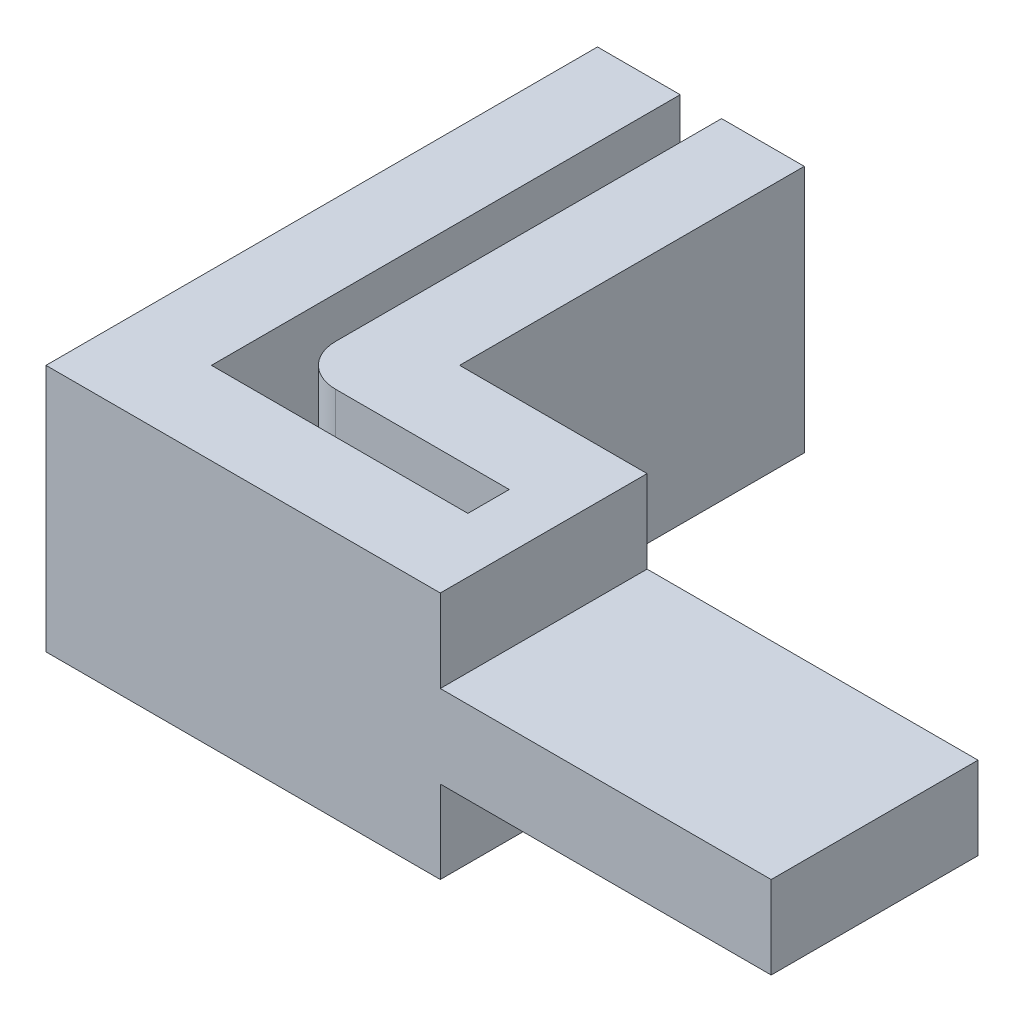
ISO-10303-21;
HEADER;
FILE_DESCRIPTION(('STEP AP214'),'2;1');
FILE_NAME('part.step','',(''),(''),'','','');
FILE_SCHEMA(('AUTOMOTIVE_DESIGN { 1 0 10303 214 1 1 1 1 }'));
ENDSEC;
DATA;
#1=APPLICATION_CONTEXT('core data for automotive mechanical design processes');
#2=APPLICATION_PROTOCOL_DEFINITION('international standard','automotive_design',2000,#1);
#3=PRODUCT_CONTEXT('',#1,'mechanical');
#4=PRODUCT('Part','Part','',(#3));
#5=PRODUCT_RELATED_PRODUCT_CATEGORY('part','',(#4));
#6=PRODUCT_DEFINITION_FORMATION('','',#4);
#7=PRODUCT_DEFINITION_CONTEXT('part definition',#1,'design');
#8=PRODUCT_DEFINITION('design','',#6,#7);
#9=PRODUCT_DEFINITION_SHAPE('','',#8);
#10=(LENGTH_UNIT() NAMED_UNIT(*) SI_UNIT(.MILLI.,.METRE.));
#11=(NAMED_UNIT(*) PLANE_ANGLE_UNIT() SI_UNIT($,.RADIAN.));
#12=(NAMED_UNIT(*) SI_UNIT($,.STERADIAN.) SOLID_ANGLE_UNIT());
#13=UNCERTAINTY_MEASURE_WITH_UNIT(LENGTH_MEASURE(1.E-05),#10,'distance_accuracy_value','');
#14=(GEOMETRIC_REPRESENTATION_CONTEXT(3) GLOBAL_UNCERTAINTY_ASSIGNED_CONTEXT((#13)) GLOBAL_UNIT_ASSIGNED_CONTEXT((#10,
#11,#12)) REPRESENTATION_CONTEXT('',''));
#15=CARTESIAN_POINT('',(0.,0.,0.));
#16=DIRECTION('',(0.,0.,1.));
#17=DIRECTION('',(1.,0.,0.));
#18=AXIS2_PLACEMENT_3D('',#15,#16,#17);
#19=CARTESIAN_POINT('',(5.65,9.,0.));
#20=DIRECTION('',(-1.,0.,0.));
#21=DIRECTION('',(0.,0.,1.));
#22=AXIS2_PLACEMENT_3D('',#19,#20,#21);
#23=PLANE('',#22);
#24=DIRECTION('',(0.,0.,-1.));
#25=VECTOR('',#24,1.);
#26=CARTESIAN_POINT('',(5.65,3.,1.5));
#27=LINE('',#26,#25);
#28=CARTESIAN_POINT('',(5.65,3.,1.5));
#29=VERTEX_POINT('',#28);
#30=CARTESIAN_POINT('',(5.65,3.,-6.));
#31=VERTEX_POINT('',#30);
#32=EDGE_CURVE('E50',#29,#31,#27,.T.);
#33=ORIENTED_EDGE('',*,*,#32,.F.);
#34=DIRECTION('',(0.,-1.,0.));
#35=VECTOR('',#34,1.);
#36=CARTESIAN_POINT('',(5.65,9.,1.5));
#37=LINE('',#36,#35);
#38=CARTESIAN_POINT('',(5.65,0.,1.5));
#39=VERTEX_POINT('',#38);
#40=EDGE_CURVE('E259',#29,#39,#37,.T.);
#41=ORIENTED_EDGE('',*,*,#40,.T.);
#42=DIRECTION('',(0.,0.,-1.));
#43=VECTOR('',#42,1.);
#44=CARTESIAN_POINT('',(5.65,0.,0.));
#45=LINE('',#44,#43);
#46=CARTESIAN_POINT('',(5.65,0.,-6.));
#47=VERTEX_POINT('',#46);
#48=EDGE_CURVE('E225',#39,#47,#45,.T.);
#49=ORIENTED_EDGE('',*,*,#48,.T.);
#50=DIRECTION('',(0.,-1.,0.));
#51=VECTOR('',#50,1.);
#52=CARTESIAN_POINT('',(5.65,9.,-6.));
#53=LINE('',#52,#51);
#54=EDGE_CURVE('E55',#31,#47,#53,.T.);
#55=ORIENTED_EDGE('',*,*,#54,.F.);
#56=EDGE_LOOP('',(#33,#41,#49,#55));
#57=FACE_BOUND('',#56,.T.);
#58=ADVANCED_FACE('F35',(#57),#23,.F.);
#59=DIRECTION('',(0.,0.,1.));
#60=VECTOR('',#59,1.);
#61=CARTESIAN_POINT('',(5.65,6.,1.5));
#62=LINE('',#61,#60);
#63=CARTESIAN_POINT('',(5.65,6.,-6.));
#64=VERTEX_POINT('',#63);
#65=CARTESIAN_POINT('',(5.65,6.,1.5));
#66=VERTEX_POINT('',#65);
#67=EDGE_CURVE('E339',#64,#66,#62,.T.);
#68=ORIENTED_EDGE('',*,*,#67,.F.);
#69=CARTESIAN_POINT('',(5.65,9.,-6.));
#70=VERTEX_POINT('',#69);
#71=EDGE_CURVE('E177',#70,#64,#53,.T.);
#72=ORIENTED_EDGE('',*,*,#71,.F.);
#73=DIRECTION('',(0.,0.,-1.));
#74=VECTOR('',#73,1.);
#75=CARTESIAN_POINT('',(5.65,9.,0.));
#76=LINE('',#75,#74);
#77=CARTESIAN_POINT('',(5.65,9.,1.5));
#78=VERTEX_POINT('',#77);
#79=EDGE_CURVE('E198',#78,#70,#76,.T.);
#80=ORIENTED_EDGE('',*,*,#79,.F.);
#81=EDGE_CURVE('E260',#78,#66,#37,.T.);
#82=ORIENTED_EDGE('',*,*,#81,.T.);
#83=EDGE_LOOP('',(#68,#72,#80,#82));
#84=FACE_BOUND('',#83,.T.);
#85=ADVANCED_FACE('F322',(#84),#23,.F.);
#86=CARTESIAN_POINT('',(-5.65,9.,0.));
#87=DIRECTION('',(1.,0.,0.));
#88=DIRECTION('',(0.,0.,-1.));
#89=AXIS2_PLACEMENT_3D('',#86,#87,#88);
#90=PLANE('',#89);
#91=DIRECTION('',(0.,0.,1.));
#92=VECTOR('',#91,1.);
#93=CARTESIAN_POINT('',(-5.65,0.,0.));
#94=LINE('',#93,#92);
#95=CARTESIAN_POINT('',(-5.65,0.,-18.5));
#96=VERTEX_POINT('',#95);
#97=CARTESIAN_POINT('',(-5.65,0.,-1.5));
#98=VERTEX_POINT('',#97);
#99=EDGE_CURVE('E178',#96,#98,#94,.T.);
#100=ORIENTED_EDGE('',*,*,#99,.F.);
#101=DIRECTION('',(0.,-1.,0.));
#102=VECTOR('',#101,1.);
#103=CARTESIAN_POINT('',(-5.65,9.,-18.5));
#104=LINE('',#103,#102);
#105=CARTESIAN_POINT('',(-5.65,9.,-18.5));
#106=VERTEX_POINT('',#105);
#107=EDGE_CURVE('E267',#106,#96,#104,.T.);
#108=ORIENTED_EDGE('',*,*,#107,.F.);
#109=DIRECTION('',(0.,0.,1.));
#110=VECTOR('',#109,1.);
#111=CARTESIAN_POINT('',(-5.65,9.,0.));
#112=LINE('',#111,#110);
#113=CARTESIAN_POINT('',(-5.65,9.,-1.5));
#114=VERTEX_POINT('',#113);
#115=EDGE_CURVE('E187',#106,#114,#112,.T.);
#116=ORIENTED_EDGE('',*,*,#115,.T.);
#117=DIRECTION('',(0.,-1.,0.));
#118=VECTOR('',#117,1.);
#119=CARTESIAN_POINT('',(-5.65,9.,-1.5));
#120=LINE('',#119,#118);
#121=EDGE_CURVE('E216',#114,#98,#120,.T.);
#122=ORIENTED_EDGE('',*,*,#121,.T.);
#123=EDGE_LOOP('',(#100,#108,#116,#122));
#124=FACE_BOUND('',#123,.T.);
#125=ADVANCED_FACE('F306',(#124),#90,.T.);
#126=CARTESIAN_POINT('',(0.,9.,-18.5));
#127=DIRECTION('',(0.,0.,-1.));
#128=DIRECTION('',(-1.,0.,0.));
#129=AXIS2_PLACEMENT_3D('',#126,#127,#128);
#130=PLANE('',#129);
#131=DIRECTION('',(1.,0.,0.));
#132=VECTOR('',#131,1.);
#133=CARTESIAN_POINT('',(0.,0.,-18.5));
#134=LINE('',#133,#132);
#135=CARTESIAN_POINT('',(-8.65,0.,-18.5));
#136=VERTEX_POINT('',#135);
#137=EDGE_CURVE('E181',#136,#96,#134,.T.);
#138=ORIENTED_EDGE('',*,*,#137,.F.);
#139=DIRECTION('',(0.,-1.,0.));
#140=VECTOR('',#139,1.);
#141=CARTESIAN_POINT('',(-8.65,9.,-18.5));
#142=LINE('',#141,#140);
#143=CARTESIAN_POINT('',(-8.65,9.,-18.5));
#144=VERTEX_POINT('',#143);
#145=EDGE_CURVE('E265',#144,#136,#142,.T.);
#146=ORIENTED_EDGE('',*,*,#145,.F.);
#147=DIRECTION('',(1.,0.,0.));
#148=VECTOR('',#147,1.);
#149=CARTESIAN_POINT('',(0.,9.,-18.5));
#150=LINE('',#149,#148);
#151=EDGE_CURVE('E190',#144,#106,#150,.T.);
#152=ORIENTED_EDGE('',*,*,#151,.T.);
#153=ORIENTED_EDGE('',*,*,#107,.T.);
#154=EDGE_LOOP('',(#138,#146,#152,#153));
#155=FACE_BOUND('',#154,.T.);
#156=ADVANCED_FACE('F309',(#155),#130,.T.);
#157=CARTESIAN_POINT('',(-8.65,9.,0.));
#158=DIRECTION('',(1.,0.,0.));
#159=DIRECTION('',(0.,0.,-1.));
#160=AXIS2_PLACEMENT_3D('',#157,#158,#159);
#161=PLANE('',#160);
#162=DIRECTION('',(0.,0.,1.));
#163=VECTOR('',#162,1.);
#164=CARTESIAN_POINT('',(-8.65,0.,0.));
#165=LINE('',#164,#163);
#166=CARTESIAN_POINT('',(-8.65,0.,1.5));
#167=VERTEX_POINT('',#166);
#168=EDGE_CURVE('E220',#136,#167,#165,.T.);
#169=ORIENTED_EDGE('',*,*,#168,.T.);
#170=DIRECTION('',(0.,-1.,0.));
#171=VECTOR('',#170,1.);
#172=CARTESIAN_POINT('',(-8.65,9.,1.5));
#173=LINE('',#172,#171);
#174=CARTESIAN_POINT('',(-8.65,9.,1.5));
#175=VERTEX_POINT('',#174);
#176=EDGE_CURVE('E262',#175,#167,#173,.T.);
#177=ORIENTED_EDGE('',*,*,#176,.F.);
#178=DIRECTION('',(0.,0.,1.));
#179=VECTOR('',#178,1.);
#180=CARTESIAN_POINT('',(-8.65,9.,0.));
#181=LINE('',#180,#179);
#182=EDGE_CURVE('E194',#144,#175,#181,.T.);
#183=ORIENTED_EDGE('',*,*,#182,.F.);
#184=ORIENTED_EDGE('',*,*,#145,.T.);
#185=EDGE_LOOP('',(#169,#177,#183,#184));
#186=FACE_BOUND('',#185,.T.);
#187=ADVANCED_FACE('F315',(#186),#161,.F.);
#188=CARTESIAN_POINT('',(0.,9.,1.5));
#189=DIRECTION('',(0.,0.,-1.));
#190=DIRECTION('',(-1.,0.,0.));
#191=AXIS2_PLACEMENT_3D('',#188,#189,#190);
#192=PLANE('',#191);
#193=DIRECTION('',(1.,0.,0.));
#194=VECTOR('',#193,1.);
#195=CARTESIAN_POINT('',(0.,0.,1.5));
#196=LINE('',#195,#194);
#197=EDGE_CURVE('E222',#167,#39,#196,.T.);
#198=ORIENTED_EDGE('',*,*,#197,.T.);
#199=ORIENTED_EDGE('',*,*,#40,.F.);
#200=DIRECTION('',(-1.,0.,0.));
#201=VECTOR('',#200,1.);
#202=CARTESIAN_POINT('',(17.65,3.,1.5));
#203=LINE('',#202,#201);
#204=CARTESIAN_POINT('',(17.65,3.,1.5));
#205=VERTEX_POINT('',#204);
#206=EDGE_CURVE('E183',#205,#29,#203,.T.);
#207=ORIENTED_EDGE('',*,*,#206,.F.);
#208=DIRECTION('',(0.,-1.,0.));
#209=VECTOR('',#208,1.);
#210=CARTESIAN_POINT('',(17.65,3.,1.5));
#211=LINE('',#210,#209);
#212=CARTESIAN_POINT('',(17.65,6.,1.5));
#213=VERTEX_POINT('',#212);
#214=EDGE_CURVE('E161',#213,#205,#211,.T.);
#215=ORIENTED_EDGE('',*,*,#214,.F.);
#216=DIRECTION('',(-1.,0.,0.));
#217=VECTOR('',#216,1.);
#218=CARTESIAN_POINT('',(17.65,6.,1.5));
#219=LINE('',#218,#217);
#220=EDGE_CURVE('E158',#213,#66,#219,.T.);
#221=ORIENTED_EDGE('',*,*,#220,.T.);
#222=ORIENTED_EDGE('',*,*,#81,.F.);
#223=DIRECTION('',(1.,0.,0.));
#224=VECTOR('',#223,1.);
#225=CARTESIAN_POINT('',(0.,9.,1.5));
#226=LINE('',#225,#224);
#227=EDGE_CURVE('E196',#175,#78,#226,.T.);
#228=ORIENTED_EDGE('',*,*,#227,.F.);
#229=ORIENTED_EDGE('',*,*,#176,.T.);
#230=EDGE_LOOP('',(#198,#199,#207,#215,#221,#222,#228,#229));
#231=FACE_BOUND('',#230,.T.);
#232=ADVANCED_FACE('F319',(#231),#192,.F.);
#233=CARTESIAN_POINT('',(0.,9.,-6.));
#234=DIRECTION('',(0.,0.,-1.));
#235=DIRECTION('',(-1.,0.,0.));
#236=AXIS2_PLACEMENT_3D('',#233,#234,#235);
#237=PLANE('',#236);
#238=DIRECTION('',(1.,0.,0.));
#239=VECTOR('',#238,1.);
#240=CARTESIAN_POINT('',(0.,0.,-6.));
#241=LINE('',#240,#239);
#242=CARTESIAN_POINT('',(-1.15,0.,-6.));
#243=VERTEX_POINT('',#242);
#244=EDGE_CURVE('E227',#243,#47,#241,.T.);
#245=ORIENTED_EDGE('',*,*,#244,.F.);
#246=DIRECTION('',(0.,-1.,0.));
#247=VECTOR('',#246,1.);
#248=CARTESIAN_POINT('',(-1.15,9.,-6.));
#249=LINE('',#248,#247);
#250=CARTESIAN_POINT('',(-1.15,9.,-6.));
#251=VERTEX_POINT('',#250);
#252=EDGE_CURVE('E256',#251,#243,#249,.T.);
#253=ORIENTED_EDGE('',*,*,#252,.F.);
#254=DIRECTION('',(1.,0.,0.));
#255=VECTOR('',#254,1.);
#256=CARTESIAN_POINT('',(0.,9.,-6.));
#257=LINE('',#256,#255);
#258=EDGE_CURVE('E200',#251,#70,#257,.T.);
#259=ORIENTED_EDGE('',*,*,#258,.T.);
#260=ORIENTED_EDGE('',*,*,#71,.T.);
#261=DIRECTION('',(-1.,0.,0.));
#262=VECTOR('',#261,1.);
#263=CARTESIAN_POINT('',(17.65,6.,-6.));
#264=LINE('',#263,#262);
#265=CARTESIAN_POINT('',(17.65,6.,-6.));
#266=VERTEX_POINT('',#265);
#267=EDGE_CURVE('E156',#266,#64,#264,.T.);
#268=ORIENTED_EDGE('',*,*,#267,.F.);
#269=DIRECTION('',(0.,1.,0.));
#270=VECTOR('',#269,1.);
#271=CARTESIAN_POINT('',(17.65,3.,-6.));
#272=LINE('',#271,#270);
#273=CARTESIAN_POINT('',(17.65,3.,-6.));
#274=VERTEX_POINT('',#273);
#275=EDGE_CURVE('E162',#274,#266,#272,.T.);
#276=ORIENTED_EDGE('',*,*,#275,.F.);
#277=DIRECTION('',(-1.,0.,0.));
#278=VECTOR('',#277,1.);
#279=CARTESIAN_POINT('',(17.65,3.,-6.));
#280=LINE('',#279,#278);
#281=EDGE_CURVE('E331',#274,#31,#280,.T.);
#282=ORIENTED_EDGE('',*,*,#281,.T.);
#283=ORIENTED_EDGE('',*,*,#54,.T.);
#284=EDGE_LOOP('',(#245,#253,#259,#260,#268,#276,#282,#283));
#285=FACE_BOUND('',#284,.T.);
#286=ADVANCED_FACE('F174',(#285),#237,.T.);
#287=CARTESIAN_POINT('',(-1.15,9.,0.));
#288=DIRECTION('',(1.,0.,0.));
#289=DIRECTION('',(0.,0.,-1.));
#290=AXIS2_PLACEMENT_3D('',#287,#288,#289);
#291=PLANE('',#290);
#292=DIRECTION('',(0.,0.,1.));
#293=VECTOR('',#292,1.);
#294=CARTESIAN_POINT('',(-1.15,0.,0.));
#295=LINE('',#294,#293);
#296=CARTESIAN_POINT('',(-1.15,0.,-18.5));
#297=VERTEX_POINT('',#296);
#298=EDGE_CURVE('E230',#297,#243,#295,.T.);
#299=ORIENTED_EDGE('',*,*,#298,.F.);
#300=DIRECTION('',(0.,-1.,0.));
#301=VECTOR('',#300,1.);
#302=CARTESIAN_POINT('',(-1.15,9.,-18.5));
#303=LINE('',#302,#301);
#304=CARTESIAN_POINT('',(-1.15,9.,-18.5));
#305=VERTEX_POINT('',#304);
#306=EDGE_CURVE('E254',#305,#297,#303,.T.);
#307=ORIENTED_EDGE('',*,*,#306,.F.);
#308=DIRECTION('',(0.,0.,1.));
#309=VECTOR('',#308,1.);
#310=CARTESIAN_POINT('',(-1.15,9.,0.));
#311=LINE('',#310,#309);
#312=EDGE_CURVE('E202',#305,#251,#311,.T.);
#313=ORIENTED_EDGE('',*,*,#312,.T.);
#314=ORIENTED_EDGE('',*,*,#252,.T.);
#315=EDGE_LOOP('',(#299,#307,#313,#314));
#316=FACE_BOUND('',#315,.T.);
#317=ADVANCED_FACE('F326',(#316),#291,.T.);
#318=CARTESIAN_POINT('',(0.,9.,-18.5));
#319=DIRECTION('',(0.,0.,1.));
#320=DIRECTION('',(1.,0.,0.));
#321=AXIS2_PLACEMENT_3D('',#318,#319,#320);
#322=PLANE('',#321);
#323=DIRECTION('',(-1.,0.,0.));
#324=VECTOR('',#323,1.);
#325=CARTESIAN_POINT('',(0.,0.,-18.5));
#326=LINE('',#325,#324);
#327=CARTESIAN_POINT('',(-4.15,0.,-18.5));
#328=VERTEX_POINT('',#327);
#329=EDGE_CURVE('E233',#297,#328,#326,.T.);
#330=ORIENTED_EDGE('',*,*,#329,.T.);
#331=DIRECTION('',(0.,-1.,0.));
#332=VECTOR('',#331,1.);
#333=CARTESIAN_POINT('',(-4.15,9.,-18.5));
#334=LINE('',#333,#332);
#335=CARTESIAN_POINT('',(-4.15,9.,-18.5));
#336=VERTEX_POINT('',#335);
#337=EDGE_CURVE('E251',#336,#328,#334,.T.);
#338=ORIENTED_EDGE('',*,*,#337,.F.);
#339=DIRECTION('',(-1.,0.,0.));
#340=VECTOR('',#339,1.);
#341=CARTESIAN_POINT('',(0.,9.,-18.5));
#342=LINE('',#341,#340);
#343=EDGE_CURVE('E205',#305,#336,#342,.T.);
#344=ORIENTED_EDGE('',*,*,#343,.F.);
#345=ORIENTED_EDGE('',*,*,#306,.T.);
#346=EDGE_LOOP('',(#330,#338,#344,#345));
#347=FACE_BOUND('',#346,.T.);
#348=ADVANCED_FACE('F329',(#347),#322,.F.);
#349=CARTESIAN_POINT('',(-4.15,9.,0.));
#350=DIRECTION('',(-1.,0.,0.));
#351=DIRECTION('',(0.,0.,1.));
#352=AXIS2_PLACEMENT_3D('',#349,#350,#351);
#353=PLANE('',#352);
#354=DIRECTION('',(0.,0.,-1.));
#355=VECTOR('',#354,1.);
#356=CARTESIAN_POINT('',(-4.15,0.,0.));
#357=LINE('',#356,#355);
#358=CARTESIAN_POINT('',(-4.15,0.,-4.5));
#359=VERTEX_POINT('',#358);
#360=EDGE_CURVE('E236',#359,#328,#357,.T.);
#361=ORIENTED_EDGE('',*,*,#360,.F.);
#362=DIRECTION('',(0.,-1.,0.));
#363=VECTOR('',#362,1.);
#364=CARTESIAN_POINT('',(-4.15,9.,-4.5));
#365=LINE('',#364,#363);
#366=CARTESIAN_POINT('',(-4.15,9.,-4.5));
#367=VERTEX_POINT('',#366);
#368=EDGE_CURVE('E43',#359,#367,#365,.F.);
#369=ORIENTED_EDGE('',*,*,#368,.T.);
#370=DIRECTION('',(0.,0.,-1.));
#371=VECTOR('',#370,1.);
#372=CARTESIAN_POINT('',(-4.15,9.,0.));
#373=LINE('',#372,#371);
#374=EDGE_CURVE('E208',#367,#336,#373,.T.);
#375=ORIENTED_EDGE('',*,*,#374,.T.);
#376=ORIENTED_EDGE('',*,*,#337,.T.);
#377=EDGE_LOOP('',(#361,#369,#375,#376));
#378=FACE_BOUND('',#377,.T.);
#379=ADVANCED_FACE('F277',(#378),#353,.T.);
#380=CARTESIAN_POINT('',(0.,9.,-3.));
#381=DIRECTION('',(0.,0.,-1.));
#382=DIRECTION('',(-1.,0.,0.));
#383=AXIS2_PLACEMENT_3D('',#380,#381,#382);
#384=PLANE('',#383);
#385=DIRECTION('',(1.,0.,0.));
#386=VECTOR('',#385,1.);
#387=CARTESIAN_POINT('',(0.,9.,-3.));
#388=LINE('',#387,#386);
#389=CARTESIAN_POINT('',(-2.65,9.,-3.));
#390=VERTEX_POINT('',#389);
#391=CARTESIAN_POINT('',(3.65,9.,-3.));
#392=VERTEX_POINT('',#391);
#393=EDGE_CURVE('E210',#390,#392,#388,.T.);
#394=ORIENTED_EDGE('',*,*,#393,.F.);
#395=DIRECTION('',(0.,-1.,0.));
#396=VECTOR('',#395,1.);
#397=CARTESIAN_POINT('',(-2.65,0.,-3.));
#398=LINE('',#397,#396);
#399=CARTESIAN_POINT('',(-2.65,0.,-3.));
#400=VERTEX_POINT('',#399);
#401=EDGE_CURVE('E269',#390,#400,#398,.T.);
#402=ORIENTED_EDGE('',*,*,#401,.T.);
#403=DIRECTION('',(1.,0.,0.));
#404=VECTOR('',#403,1.);
#405=CARTESIAN_POINT('',(0.,0.,-3.));
#406=LINE('',#405,#404);
#407=CARTESIAN_POINT('',(3.65,0.,-3.));
#408=VERTEX_POINT('',#407);
#409=EDGE_CURVE('E238',#400,#408,#406,.T.);
#410=ORIENTED_EDGE('',*,*,#409,.T.);
#411=DIRECTION('',(0.,-1.,0.));
#412=VECTOR('',#411,1.);
#413=CARTESIAN_POINT('',(3.65,9.,-3.));
#414=LINE('',#413,#412);
#415=EDGE_CURVE('E248',#392,#408,#414,.T.);
#416=ORIENTED_EDGE('',*,*,#415,.F.);
#417=EDGE_LOOP('',(#394,#402,#410,#416));
#418=FACE_BOUND('',#417,.T.);
#419=ADVANCED_FACE('F289',(#418),#384,.F.);
#420=CARTESIAN_POINT('',(3.65,9.,0.));
#421=DIRECTION('',(1.,0.,0.));
#422=DIRECTION('',(0.,0.,-1.));
#423=AXIS2_PLACEMENT_3D('',#420,#421,#422);
#424=PLANE('',#423);
#425=DIRECTION('',(0.,0.,1.));
#426=VECTOR('',#425,1.);
#427=CARTESIAN_POINT('',(3.65,0.,0.));
#428=LINE('',#427,#426);
#429=CARTESIAN_POINT('',(3.65,0.,-1.5));
#430=VERTEX_POINT('',#429);
#431=EDGE_CURVE('E240',#408,#430,#428,.T.);
#432=ORIENTED_EDGE('',*,*,#431,.T.);
#433=DIRECTION('',(0.,-1.,0.));
#434=VECTOR('',#433,1.);
#435=CARTESIAN_POINT('',(3.65,9.,-1.5));
#436=LINE('',#435,#434);
#437=CARTESIAN_POINT('',(3.65,9.,-1.5));
#438=VERTEX_POINT('',#437);
#439=EDGE_CURVE('E246',#438,#430,#436,.T.);
#440=ORIENTED_EDGE('',*,*,#439,.F.);
#441=DIRECTION('',(0.,0.,1.));
#442=VECTOR('',#441,1.);
#443=CARTESIAN_POINT('',(3.65,9.,0.));
#444=LINE('',#443,#442);
#445=EDGE_CURVE('E212',#392,#438,#444,.T.);
#446=ORIENTED_EDGE('',*,*,#445,.F.);
#447=ORIENTED_EDGE('',*,*,#415,.T.);
#448=EDGE_LOOP('',(#432,#440,#446,#447));
#449=FACE_BOUND('',#448,.T.);
#450=ADVANCED_FACE('F297',(#449),#424,.F.);
#451=CARTESIAN_POINT('',(0.,9.,-1.5));
#452=DIRECTION('',(0.,0.,-1.));
#453=DIRECTION('',(-1.,0.,0.));
#454=AXIS2_PLACEMENT_3D('',#451,#452,#453);
#455=PLANE('',#454);
#456=DIRECTION('',(1.,0.,0.));
#457=VECTOR('',#456,1.);
#458=CARTESIAN_POINT('',(0.,0.,-1.5));
#459=LINE('',#458,#457);
#460=EDGE_CURVE('E191',#98,#430,#459,.T.);
#461=ORIENTED_EDGE('',*,*,#460,.F.);
#462=ORIENTED_EDGE('',*,*,#121,.F.);
#463=DIRECTION('',(1.,0.,0.));
#464=VECTOR('',#463,1.);
#465=CARTESIAN_POINT('',(0.,9.,-1.5));
#466=LINE('',#465,#464);
#467=EDGE_CURVE('E214',#114,#438,#466,.T.);
#468=ORIENTED_EDGE('',*,*,#467,.T.);
#469=ORIENTED_EDGE('',*,*,#439,.T.);
#470=EDGE_LOOP('',(#461,#462,#468,#469));
#471=FACE_BOUND('',#470,.T.);
#472=ADVANCED_FACE('F303',(#471),#455,.T.);
#473=CARTESIAN_POINT('',(0.,9.,0.));
#474=DIRECTION('',(0.,1.,0.));
#475=DIRECTION('',(0.,0.,1.));
#476=AXIS2_PLACEMENT_3D('',#473,#474,#475);
#477=PLANE('',#476);
#478=ORIENTED_EDGE('',*,*,#374,.F.);
#479=CARTESIAN_POINT('',(-2.65,9.,-4.5));
#480=DIRECTION('',(0.,1.,0.));
#481=DIRECTION('',(0.,0.,1.));
#482=AXIS2_PLACEMENT_3D('',#479,#480,#481);
#483=CIRCLE('',#482,1.5);
#484=EDGE_CURVE('E11',#367,#390,#483,.T.);
#485=ORIENTED_EDGE('',*,*,#484,.T.);
#486=ORIENTED_EDGE('',*,*,#393,.T.);
#487=ORIENTED_EDGE('',*,*,#445,.T.);
#488=ORIENTED_EDGE('',*,*,#467,.F.);
#489=ORIENTED_EDGE('',*,*,#115,.F.);
#490=ORIENTED_EDGE('',*,*,#151,.F.);
#491=ORIENTED_EDGE('',*,*,#182,.T.);
#492=ORIENTED_EDGE('',*,*,#227,.T.);
#493=ORIENTED_EDGE('',*,*,#79,.T.);
#494=ORIENTED_EDGE('',*,*,#258,.F.);
#495=ORIENTED_EDGE('',*,*,#312,.F.);
#496=ORIENTED_EDGE('',*,*,#343,.T.);
#497=EDGE_LOOP('',(#478,#485,#486,#487,#488,#489,#490,#491,#492,#493,#494,#495,#496));
#498=FACE_BOUND('',#497,.T.);
#499=ADVANCED_FACE('F281',(#498),#477,.T.);
#500=CARTESIAN_POINT('',(0.,0.,0.));
#501=DIRECTION('',(0.,1.,0.));
#502=DIRECTION('',(0.,0.,1.));
#503=AXIS2_PLACEMENT_3D('',#500,#501,#502);
#504=PLANE('',#503);
#505=ORIENTED_EDGE('',*,*,#409,.F.);
#506=CARTESIAN_POINT('',(-2.65,0.,-4.5));
#507=DIRECTION('',(0.,1.,0.));
#508=DIRECTION('',(0.,0.,1.));
#509=AXIS2_PLACEMENT_3D('',#506,#507,#508);
#510=CIRCLE('',#509,1.5);
#511=EDGE_CURVE('E272',#400,#359,#510,.F.);
#512=ORIENTED_EDGE('',*,*,#511,.T.);
#513=ORIENTED_EDGE('',*,*,#360,.T.);
#514=ORIENTED_EDGE('',*,*,#329,.F.);
#515=ORIENTED_EDGE('',*,*,#298,.T.);
#516=ORIENTED_EDGE('',*,*,#244,.T.);
#517=ORIENTED_EDGE('',*,*,#48,.F.);
#518=ORIENTED_EDGE('',*,*,#197,.F.);
#519=ORIENTED_EDGE('',*,*,#168,.F.);
#520=ORIENTED_EDGE('',*,*,#137,.T.);
#521=ORIENTED_EDGE('',*,*,#99,.T.);
#522=ORIENTED_EDGE('',*,*,#460,.T.);
#523=ORIENTED_EDGE('',*,*,#431,.F.);
#524=EDGE_LOOP('',(#505,#512,#513,#514,#515,#516,#517,#518,#519,#520,#521,#522,#523));
#525=FACE_BOUND('',#524,.T.);
#526=ADVANCED_FACE('F293',(#525),#504,.F.);
#527=CARTESIAN_POINT('',(-2.65,9.,-4.5));
#528=DIRECTION('',(0.,1.,0.));
#529=DIRECTION('',(0.,0.,1.));
#530=AXIS2_PLACEMENT_3D('',#527,#528,#529);
#531=CYLINDRICAL_SURFACE('',#530,1.5);
#532=ORIENTED_EDGE('',*,*,#484,.F.);
#533=ORIENTED_EDGE('',*,*,#368,.F.);
#534=ORIENTED_EDGE('',*,*,#511,.F.);
#535=ORIENTED_EDGE('',*,*,#401,.F.);
#536=EDGE_LOOP('',(#532,#533,#534,#535));
#537=FACE_BOUND('',#536,.T.);
#538=ADVANCED_FACE('F37',(#537),#531,.T.);
#539=CARTESIAN_POINT('',(17.65,6.,1.5));
#540=DIRECTION('',(0.,-1.,0.));
#541=DIRECTION('',(0.,0.,-1.));
#542=AXIS2_PLACEMENT_3D('',#539,#540,#541);
#543=PLANE('',#542);
#544=ORIENTED_EDGE('',*,*,#67,.T.);
#545=ORIENTED_EDGE('',*,*,#220,.F.);
#546=DIRECTION('',(0.,0.,1.));
#547=VECTOR('',#546,1.);
#548=CARTESIAN_POINT('',(17.65,6.,1.5));
#549=LINE('',#548,#547);
#550=EDGE_CURVE('E151',#266,#213,#549,.T.);
#551=ORIENTED_EDGE('',*,*,#550,.F.);
#552=ORIENTED_EDGE('',*,*,#267,.T.);
#553=EDGE_LOOP('',(#544,#545,#551,#552));
#554=FACE_BOUND('',#553,.T.);
#555=ADVANCED_FACE('F154',(#554),#543,.F.);
#556=CARTESIAN_POINT('',(17.65,3.,1.5));
#557=DIRECTION('',(0.,1.,0.));
#558=DIRECTION('',(0.,0.,1.));
#559=AXIS2_PLACEMENT_3D('',#556,#557,#558);
#560=PLANE('',#559);
#561=ORIENTED_EDGE('',*,*,#32,.T.);
#562=ORIENTED_EDGE('',*,*,#281,.F.);
#563=DIRECTION('',(0.,0.,-1.));
#564=VECTOR('',#563,1.);
#565=CARTESIAN_POINT('',(17.65,3.,1.5));
#566=LINE('',#565,#564);
#567=EDGE_CURVE('E167',#205,#274,#566,.T.);
#568=ORIENTED_EDGE('',*,*,#567,.F.);
#569=ORIENTED_EDGE('',*,*,#206,.T.);
#570=EDGE_LOOP('',(#561,#562,#568,#569));
#571=FACE_BOUND('',#570,.T.);
#572=ADVANCED_FACE('F335',(#571),#560,.F.);
#573=CARTESIAN_POINT('',(17.65,0.,0.));
#574=DIRECTION('',(-1.,0.,0.));
#575=DIRECTION('',(0.,0.,1.));
#576=AXIS2_PLACEMENT_3D('',#573,#574,#575);
#577=PLANE('',#576);
#578=ORIENTED_EDGE('',*,*,#275,.T.);
#579=ORIENTED_EDGE('',*,*,#550,.T.);
#580=ORIENTED_EDGE('',*,*,#214,.T.);
#581=ORIENTED_EDGE('',*,*,#567,.T.);
#582=EDGE_LOOP('',(#578,#579,#580,#581));
#583=FACE_BOUND('',#582,.T.);
#584=ADVANCED_FACE('F165',(#583),#577,.F.);
#585=CLOSED_SHELL('',(#58,#85,#125,#156,#187,#232,#286,#317,#348,#379,#419,#450,#472,#499,#526,
#538,#555,#572,#584));
#586=MANIFOLD_SOLID_BREP('B2',#585);
#587=ADVANCED_BREP_SHAPE_REPRESENTATION('',(#18,#586),#14);
#588=SHAPE_DEFINITION_REPRESENTATION(#9,#587);
ENDSEC;
END-ISO-10303-21;
